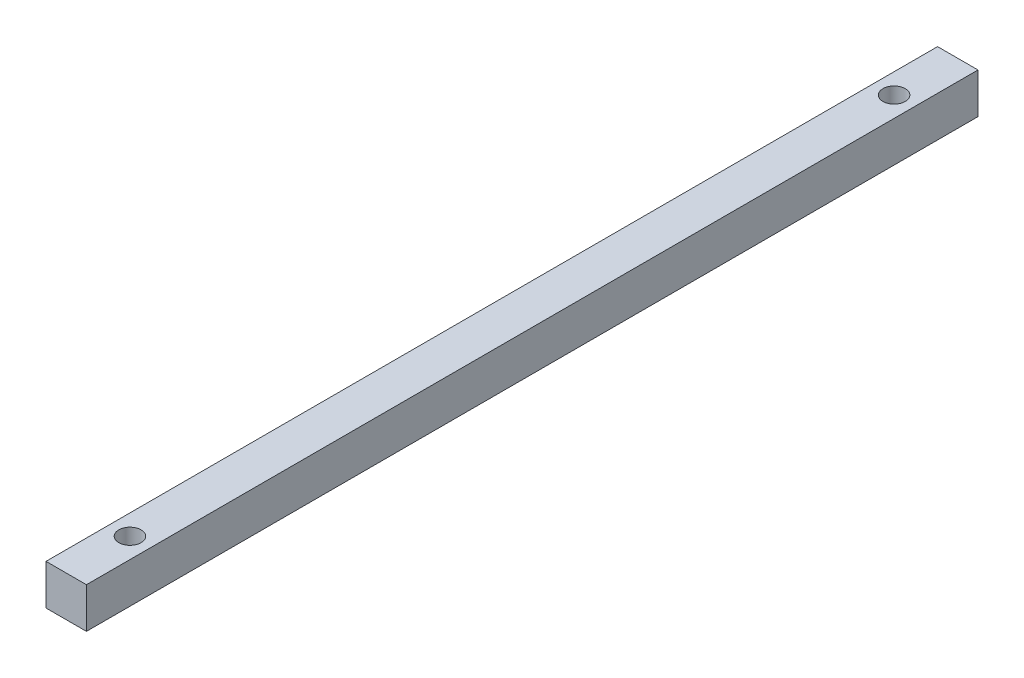
ISO-10303-21;
HEADER;
FILE_DESCRIPTION(('STEP AP214'),'2;1');
FILE_NAME('part.step','',(''),(''),'','','');
FILE_SCHEMA(('AUTOMOTIVE_DESIGN { 1 0 10303 214 1 1 1 1 }'));
ENDSEC;
DATA;
#1=APPLICATION_CONTEXT('core data for automotive mechanical design processes');
#2=APPLICATION_PROTOCOL_DEFINITION('international standard','automotive_design',2000,#1);
#3=PRODUCT_CONTEXT('',#1,'mechanical');
#4=PRODUCT('Part','Part','',(#3));
#5=PRODUCT_RELATED_PRODUCT_CATEGORY('part','',(#4));
#6=PRODUCT_DEFINITION_FORMATION('','',#4);
#7=PRODUCT_DEFINITION_CONTEXT('part definition',#1,'design');
#8=PRODUCT_DEFINITION('design','',#6,#7);
#9=PRODUCT_DEFINITION_SHAPE('','',#8);
#10=(LENGTH_UNIT() NAMED_UNIT(*) SI_UNIT(.MILLI.,.METRE.));
#11=(NAMED_UNIT(*) PLANE_ANGLE_UNIT() SI_UNIT($,.RADIAN.));
#12=(NAMED_UNIT(*) SI_UNIT($,.STERADIAN.) SOLID_ANGLE_UNIT());
#13=UNCERTAINTY_MEASURE_WITH_UNIT(LENGTH_MEASURE(1.E-05),#10,'distance_accuracy_value','');
#14=(GEOMETRIC_REPRESENTATION_CONTEXT(3) GLOBAL_UNCERTAINTY_ASSIGNED_CONTEXT((#13)) GLOBAL_UNIT_ASSIGNED_CONTEXT((#10,
#11,#12)) REPRESENTATION_CONTEXT('',''));
#15=CARTESIAN_POINT('',(0.,0.,0.));
#16=DIRECTION('',(0.,0.,1.));
#17=DIRECTION('',(1.,0.,0.));
#18=AXIS2_PLACEMENT_3D('',#15,#16,#17);
#19=CARTESIAN_POINT('',(3.175,-3.175,609.6));
#20=DIRECTION('',(-1.,0.,0.));
#21=DIRECTION('',(0.,0.,1.));
#22=AXIS2_PLACEMENT_3D('',#19,#20,#21);
#23=PLANE('',#22);
#24=DIRECTION('',(0.,0.,-1.));
#25=VECTOR('',#24,1.);
#26=CARTESIAN_POINT('',(3.175,3.175,609.6));
#27=LINE('',#26,#25);
#28=CARTESIAN_POINT('',(3.175,3.175,-469.6));
#29=VERTEX_POINT('',#28);
#30=CARTESIAN_POINT('',(3.175,3.175,-609.6));
#31=VERTEX_POINT('',#30);
#32=EDGE_CURVE('E47',#29,#31,#27,.T.);
#33=ORIENTED_EDGE('',*,*,#32,.F.);
#34=DIRECTION('',(0.,-1.,0.));
#35=VECTOR('',#34,1.);
#36=CARTESIAN_POINT('',(3.175,-3.175,-469.6));
#37=LINE('',#36,#35);
#38=CARTESIAN_POINT('',(3.175,-3.175,-469.6));
#39=VERTEX_POINT('',#38);
#40=EDGE_CURVE('E79',#29,#39,#37,.T.);
#41=ORIENTED_EDGE('',*,*,#40,.T.);
#42=DIRECTION('',(0.,0.,-1.));
#43=VECTOR('',#42,1.);
#44=CARTESIAN_POINT('',(3.175,-3.175,609.6));
#45=LINE('',#44,#43);
#46=CARTESIAN_POINT('',(3.175,-3.175,-609.6));
#47=VERTEX_POINT('',#46);
#48=EDGE_CURVE('E61',#39,#47,#45,.T.);
#49=ORIENTED_EDGE('',*,*,#48,.T.);
#50=DIRECTION('',(0.,1.,0.));
#51=VECTOR('',#50,1.);
#52=CARTESIAN_POINT('',(3.175,-3.175,-609.6));
#53=LINE('',#52,#51);
#54=EDGE_CURVE('E85',#47,#31,#53,.T.);
#55=ORIENTED_EDGE('',*,*,#54,.T.);
#56=EDGE_LOOP('',(#33,#41,#49,#55));
#57=FACE_BOUND('',#56,.T.);
#58=ADVANCED_FACE('F39',(#57),#23,.F.);
#59=CARTESIAN_POINT('',(-3.175,3.175,609.6));
#60=DIRECTION('',(0.,-1.,0.));
#61=DIRECTION('',(0.,0.,-1.));
#62=AXIS2_PLACEMENT_3D('',#59,#60,#61);
#63=PLANE('',#62);
#64=CARTESIAN_POINT('',(0.,3.175,-599.6));
#65=DIRECTION('',(0.,1.,0.));
#66=DIRECTION('',(0.,0.,1.));
#67=AXIS2_PLACEMENT_3D('',#64,#65,#66);
#68=CIRCLE('',#67,1.74999999999997);
#69=CARTESIAN_POINT('',(0.,3.175,-597.85));
#70=VERTEX_POINT('',#69);
#71=EDGE_CURVE('E129',#70,#70,#68,.T.);
#72=ORIENTED_EDGE('',*,*,#71,.F.);
#73=EDGE_LOOP('',(#72));
#74=FACE_BOUND('',#73,.T.);
#75=CARTESIAN_POINT('',(0.,3.175,-479.6));
#76=DIRECTION('',(0.,1.,0.));
#77=DIRECTION('',(0.,0.,1.));
#78=AXIS2_PLACEMENT_3D('',#75,#76,#77);
#79=CIRCLE('',#78,1.75);
#80=CARTESIAN_POINT('',(0.,3.175,-477.85));
#81=VERTEX_POINT('',#80);
#82=EDGE_CURVE('E132',#81,#81,#79,.T.);
#83=ORIENTED_EDGE('',*,*,#82,.F.);
#84=EDGE_LOOP('',(#83));
#85=FACE_BOUND('',#84,.T.);
#86=DIRECTION('',(0.,0.,-1.));
#87=VECTOR('',#86,1.);
#88=CARTESIAN_POINT('',(-3.175,3.175,609.6));
#89=LINE('',#88,#87);
#90=CARTESIAN_POINT('',(-3.175,3.175,-469.6));
#91=VERTEX_POINT('',#90);
#92=CARTESIAN_POINT('',(-3.175,3.175,-609.6));
#93=VERTEX_POINT('',#92);
#94=EDGE_CURVE('E97',#91,#93,#89,.T.);
#95=ORIENTED_EDGE('',*,*,#94,.F.);
#96=DIRECTION('',(1.,0.,0.));
#97=VECTOR('',#96,1.);
#98=CARTESIAN_POINT('',(-3.175,3.175,-469.6));
#99=LINE('',#98,#97);
#100=EDGE_CURVE('E86',#91,#29,#99,.T.);
#101=ORIENTED_EDGE('',*,*,#100,.T.);
#102=ORIENTED_EDGE('',*,*,#32,.T.);
#103=DIRECTION('',(-1.,0.,0.));
#104=VECTOR('',#103,1.);
#105=CARTESIAN_POINT('',(-3.175,3.175,-609.6));
#106=LINE('',#105,#104);
#107=EDGE_CURVE('E110',#31,#93,#106,.T.);
#108=ORIENTED_EDGE('',*,*,#107,.T.);
#109=EDGE_LOOP('',(#95,#101,#102,#108));
#110=FACE_BOUND('',#109,.T.);
#111=ADVANCED_FACE('F109',(#74,#85,#110),#63,.F.);
#112=CARTESIAN_POINT('',(-3.175,-3.175,609.6));
#113=DIRECTION('',(1.,0.,0.));
#114=DIRECTION('',(0.,1.,0.));
#115=AXIS2_PLACEMENT_3D('',#112,#113,#114);
#116=PLANE('',#115);
#117=DIRECTION('',(0.,0.,-1.));
#118=VECTOR('',#117,1.);
#119=CARTESIAN_POINT('',(-3.175,-3.175,609.6));
#120=LINE('',#119,#118);
#121=CARTESIAN_POINT('',(-3.175,-3.175,-469.6));
#122=VERTEX_POINT('',#121);
#123=CARTESIAN_POINT('',(-3.175,-3.175,-609.6));
#124=VERTEX_POINT('',#123);
#125=EDGE_CURVE('E93',#122,#124,#120,.T.);
#126=ORIENTED_EDGE('',*,*,#125,.F.);
#127=DIRECTION('',(0.,1.,0.));
#128=VECTOR('',#127,1.);
#129=CARTESIAN_POINT('',(-3.175,-3.175,-469.6));
#130=LINE('',#129,#128);
#131=EDGE_CURVE('E54',#122,#91,#130,.T.);
#132=ORIENTED_EDGE('',*,*,#131,.T.);
#133=ORIENTED_EDGE('',*,*,#94,.T.);
#134=DIRECTION('',(0.,-1.,0.));
#135=VECTOR('',#134,1.);
#136=CARTESIAN_POINT('',(-3.175,-3.175,-609.6));
#137=LINE('',#136,#135);
#138=EDGE_CURVE('E99',#93,#124,#137,.T.);
#139=ORIENTED_EDGE('',*,*,#138,.T.);
#140=EDGE_LOOP('',(#126,#132,#133,#139));
#141=FACE_BOUND('',#140,.T.);
#142=ADVANCED_FACE('F122',(#141),#116,.F.);
#143=CARTESIAN_POINT('',(-3.175,-3.175,609.6));
#144=DIRECTION('',(0.,1.,0.));
#145=DIRECTION('',(-1.,0.,0.));
#146=AXIS2_PLACEMENT_3D('',#143,#144,#145);
#147=PLANE('',#146);
#148=CARTESIAN_POINT('',(0.,-3.175,-599.6));
#149=DIRECTION('',(0.,1.,0.));
#150=DIRECTION('',(0.,0.,1.));
#151=AXIS2_PLACEMENT_3D('',#148,#149,#150);
#152=CIRCLE('',#151,1.74999999999997);
#153=CARTESIAN_POINT('',(0.,-3.175,-597.85));
#154=VERTEX_POINT('',#153);
#155=EDGE_CURVE('E124',#154,#154,#152,.T.);
#156=ORIENTED_EDGE('',*,*,#155,.T.);
#157=EDGE_LOOP('',(#156));
#158=FACE_BOUND('',#157,.T.);
#159=CARTESIAN_POINT('',(0.,-3.175,-479.6));
#160=DIRECTION('',(0.,1.,0.));
#161=DIRECTION('',(0.,0.,1.));
#162=AXIS2_PLACEMENT_3D('',#159,#160,#161);
#163=CIRCLE('',#162,1.75);
#164=CARTESIAN_POINT('',(0.,-3.175,-477.85));
#165=VERTEX_POINT('',#164);
#166=EDGE_CURVE('E136',#165,#165,#163,.T.);
#167=ORIENTED_EDGE('',*,*,#166,.T.);
#168=EDGE_LOOP('',(#167));
#169=FACE_BOUND('',#168,.T.);
#170=ORIENTED_EDGE('',*,*,#48,.F.);
#171=DIRECTION('',(-1.,0.,0.));
#172=VECTOR('',#171,1.);
#173=CARTESIAN_POINT('',(-3.175,-3.175,-469.6));
#174=LINE('',#173,#172);
#175=EDGE_CURVE('E11',#39,#122,#174,.T.);
#176=ORIENTED_EDGE('',*,*,#175,.T.);
#177=ORIENTED_EDGE('',*,*,#125,.T.);
#178=DIRECTION('',(1.,0.,0.));
#179=VECTOR('',#178,1.);
#180=CARTESIAN_POINT('',(-3.175,-3.175,-609.6));
#181=LINE('',#180,#179);
#182=EDGE_CURVE('E91',#124,#47,#181,.T.);
#183=ORIENTED_EDGE('',*,*,#182,.T.);
#184=EDGE_LOOP('',(#170,#176,#177,#183));
#185=FACE_BOUND('',#184,.T.);
#186=ADVANCED_FACE('F89',(#158,#169,#185),#147,.F.);
#187=CARTESIAN_POINT('',(0.,0.,-609.6));
#188=DIRECTION('',(0.,0.,-1.));
#189=DIRECTION('',(-1.,0.,0.));
#190=AXIS2_PLACEMENT_3D('',#187,#188,#189);
#191=PLANE('',#190);
#192=ORIENTED_EDGE('',*,*,#54,.F.);
#193=ORIENTED_EDGE('',*,*,#182,.F.);
#194=ORIENTED_EDGE('',*,*,#138,.F.);
#195=ORIENTED_EDGE('',*,*,#107,.F.);
#196=EDGE_LOOP('',(#192,#193,#194,#195));
#197=FACE_BOUND('',#196,.T.);
#198=ADVANCED_FACE('F113',(#197),#191,.T.);
#199=CARTESIAN_POINT('',(0.,0.,-469.6));
#200=DIRECTION('',(0.,0.,-1.));
#201=DIRECTION('',(-1.,0.,0.));
#202=AXIS2_PLACEMENT_3D('',#199,#200,#201);
#203=PLANE('',#202);
#204=ORIENTED_EDGE('',*,*,#100,.F.);
#205=ORIENTED_EDGE('',*,*,#131,.F.);
#206=ORIENTED_EDGE('',*,*,#175,.F.);
#207=ORIENTED_EDGE('',*,*,#40,.F.);
#208=EDGE_LOOP('',(#204,#205,#206,#207));
#209=FACE_BOUND('',#208,.T.);
#210=ADVANCED_FACE('F78',(#209),#203,.F.);
#211=CARTESIAN_POINT('',(0.,-3.175,-479.6));
#212=DIRECTION('',(0.,1.,0.));
#213=DIRECTION('',(0.,0.,1.));
#214=AXIS2_PLACEMENT_3D('',#211,#212,#213);
#215=CYLINDRICAL_SURFACE('',#214,1.75);
#216=ORIENTED_EDGE('',*,*,#166,.F.);
#217=EDGE_LOOP('',(#216));
#218=FACE_BOUND('',#217,.T.);
#219=ORIENTED_EDGE('',*,*,#82,.T.);
#220=EDGE_LOOP('',(#219));
#221=FACE_BOUND('',#220,.T.);
#222=ADVANCED_FACE('F150',(#218,#221),#215,.F.);
#223=CARTESIAN_POINT('',(0.,-3.175,-599.6));
#224=DIRECTION('',(0.,1.,0.));
#225=DIRECTION('',(0.,0.,1.));
#226=AXIS2_PLACEMENT_3D('',#223,#224,#225);
#227=CYLINDRICAL_SURFACE('',#226,1.74999999999997);
#228=ORIENTED_EDGE('',*,*,#155,.F.);
#229=EDGE_LOOP('',(#228));
#230=FACE_BOUND('',#229,.T.);
#231=ORIENTED_EDGE('',*,*,#71,.T.);
#232=EDGE_LOOP('',(#231));
#233=FACE_BOUND('',#232,.T.);
#234=ADVANCED_FACE('F144',(#230,#233),#227,.F.);
#235=CLOSED_SHELL('',(#58,#111,#142,#186,#198,#210,#222,#234));
#236=MANIFOLD_SOLID_BREP('B2',#235);
#237=ADVANCED_BREP_SHAPE_REPRESENTATION('',(#18,#236),#14);
#238=SHAPE_DEFINITION_REPRESENTATION(#9,#237);
ENDSEC;
END-ISO-10303-21;
